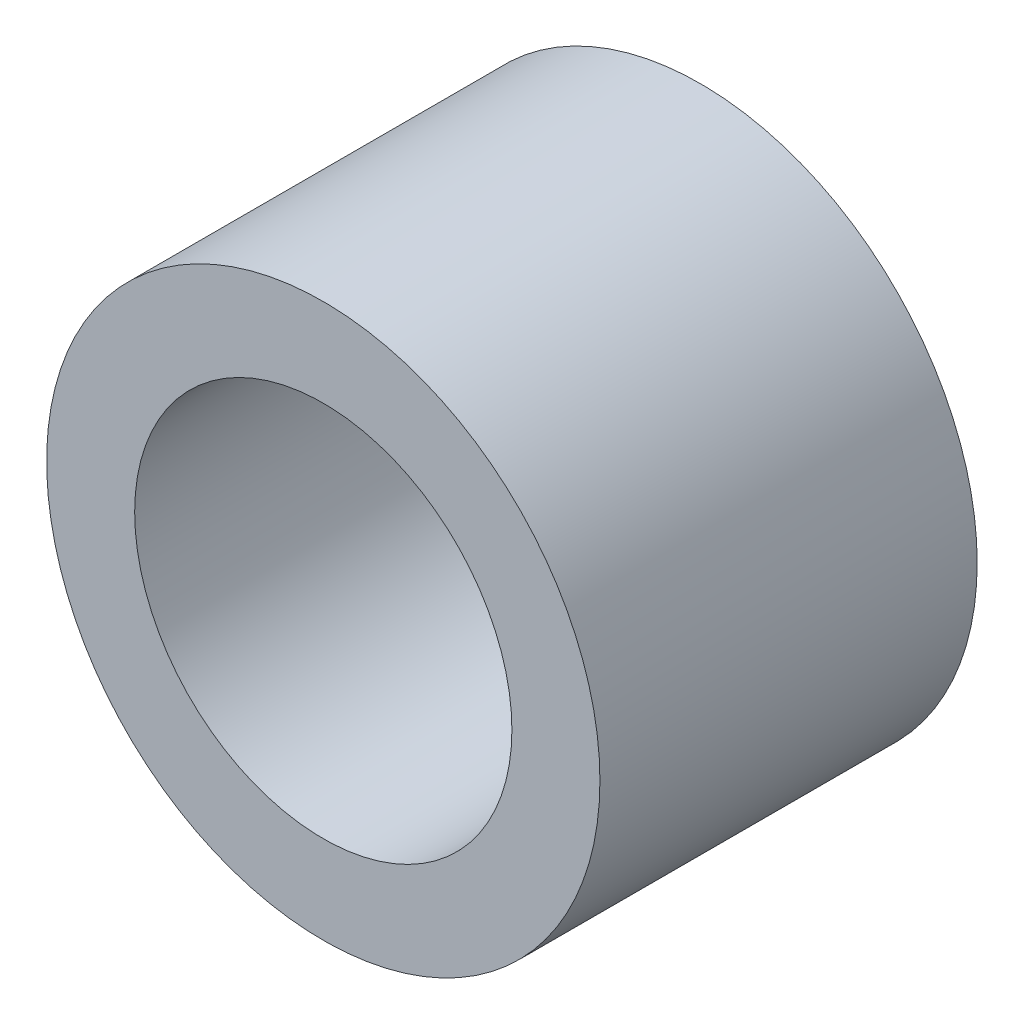
ISO-10303-21;
HEADER;
FILE_DESCRIPTION(('STEP AP214'),'2;1');
FILE_NAME('part.step','',(''),(''),'','','');
FILE_SCHEMA(('AUTOMOTIVE_DESIGN { 1 0 10303 214 1 1 1 1 }'));
ENDSEC;
DATA;
#1=APPLICATION_CONTEXT('core data for automotive mechanical design processes');
#2=APPLICATION_PROTOCOL_DEFINITION('international standard','automotive_design',2000,#1);
#3=PRODUCT_CONTEXT('',#1,'mechanical');
#4=PRODUCT('Part','Part','',(#3));
#5=PRODUCT_RELATED_PRODUCT_CATEGORY('part','',(#4));
#6=PRODUCT_DEFINITION_FORMATION('','',#4);
#7=PRODUCT_DEFINITION_CONTEXT('part definition',#1,'design');
#8=PRODUCT_DEFINITION('design','',#6,#7);
#9=PRODUCT_DEFINITION_SHAPE('','',#8);
#10=(LENGTH_UNIT() NAMED_UNIT(*) SI_UNIT(.MILLI.,.METRE.));
#11=(NAMED_UNIT(*) PLANE_ANGLE_UNIT() SI_UNIT($,.RADIAN.));
#12=(NAMED_UNIT(*) SI_UNIT($,.STERADIAN.) SOLID_ANGLE_UNIT());
#13=UNCERTAINTY_MEASURE_WITH_UNIT(LENGTH_MEASURE(1.E-05),#10,'distance_accuracy_value','');
#14=(GEOMETRIC_REPRESENTATION_CONTEXT(3) GLOBAL_UNCERTAINTY_ASSIGNED_CONTEXT((#13)) GLOBAL_UNIT_ASSIGNED_CONTEXT((#10,
#11,#12)) REPRESENTATION_CONTEXT('',''));
#15=CARTESIAN_POINT('',(0.,0.,0.));
#16=DIRECTION('',(0.,0.,1.));
#17=DIRECTION('',(1.,0.,0.));
#18=AXIS2_PLACEMENT_3D('',#15,#16,#17);
#19=CARTESIAN_POINT('',(0.,0.,3.));
#20=DIRECTION('',(0.,0.,1.));
#21=DIRECTION('',(1.,0.,0.));
#22=AXIS2_PLACEMENT_3D('',#19,#20,#21);
#23=PLANE('',#22);
#24=CARTESIAN_POINT('',(0.,0.,3.));
#25=DIRECTION('',(0.,0.,1.));
#26=DIRECTION('',(1.,0.,0.));
#27=AXIS2_PLACEMENT_3D('',#24,#25,#26);
#28=CIRCLE('',#27,2.2);
#29=CARTESIAN_POINT('',(2.2,0.,3.));
#30=VERTEX_POINT('',#29);
#31=EDGE_CURVE('E10',#30,#30,#28,.T.);
#32=ORIENTED_EDGE('',*,*,#31,.T.);
#33=EDGE_LOOP('',(#32));
#34=FACE_BOUND('',#33,.T.);
#35=CARTESIAN_POINT('',(0.,0.,3.));
#36=DIRECTION('',(0.,0.,1.));
#37=DIRECTION('',(1.,0.,0.));
#38=AXIS2_PLACEMENT_3D('',#35,#36,#37);
#39=CIRCLE('',#38,1.5);
#40=CARTESIAN_POINT('',(1.5,0.,3.));
#41=VERTEX_POINT('',#40);
#42=EDGE_CURVE('E50',#41,#41,#39,.T.);
#43=ORIENTED_EDGE('',*,*,#42,.F.);
#44=EDGE_LOOP('',(#43));
#45=FACE_BOUND('',#44,.T.);
#46=ADVANCED_FACE('F39',(#34,#45),#23,.T.);
#47=CARTESIAN_POINT('',(0.,0.,0.));
#48=DIRECTION('',(0.,0.,1.));
#49=DIRECTION('',(1.,0.,0.));
#50=AXIS2_PLACEMENT_3D('',#47,#48,#49);
#51=PLANE('',#50);
#52=CARTESIAN_POINT('',(0.,0.,0.));
#53=DIRECTION('',(0.,0.,1.));
#54=DIRECTION('',(1.,0.,0.));
#55=AXIS2_PLACEMENT_3D('',#52,#53,#54);
#56=CIRCLE('',#55,2.2);
#57=CARTESIAN_POINT('',(2.2,0.,0.));
#58=VERTEX_POINT('',#57);
#59=EDGE_CURVE('E43',#58,#58,#56,.T.);
#60=ORIENTED_EDGE('',*,*,#59,.F.);
#61=EDGE_LOOP('',(#60));
#62=FACE_BOUND('',#61,.T.);
#63=CARTESIAN_POINT('',(0.,0.,0.));
#64=DIRECTION('',(0.,0.,1.));
#65=DIRECTION('',(1.,0.,0.));
#66=AXIS2_PLACEMENT_3D('',#63,#64,#65);
#67=CIRCLE('',#66,1.5);
#68=CARTESIAN_POINT('',(1.5,0.,0.));
#69=VERTEX_POINT('',#68);
#70=EDGE_CURVE('E52',#69,#69,#67,.T.);
#71=ORIENTED_EDGE('',*,*,#70,.T.);
#72=EDGE_LOOP('',(#71));
#73=FACE_BOUND('',#72,.T.);
#74=ADVANCED_FACE('F62',(#62,#73),#51,.F.);
#75=CARTESIAN_POINT('',(0.,0.,3.));
#76=DIRECTION('',(0.,0.,-1.));
#77=DIRECTION('',(-1.,0.,0.));
#78=AXIS2_PLACEMENT_3D('',#75,#76,#77);
#79=CYLINDRICAL_SURFACE('',#78,2.2);
#80=ORIENTED_EDGE('',*,*,#31,.F.);
#81=EDGE_LOOP('',(#80));
#82=FACE_BOUND('',#81,.T.);
#83=ORIENTED_EDGE('',*,*,#59,.T.);
#84=EDGE_LOOP('',(#83));
#85=FACE_BOUND('',#84,.T.);
#86=ADVANCED_FACE('F41',(#82,#85),#79,.T.);
#87=CARTESIAN_POINT('',(0.,0.,3.));
#88=DIRECTION('',(0.,0.,-1.));
#89=DIRECTION('',(-1.,0.,0.));
#90=AXIS2_PLACEMENT_3D('',#87,#88,#89);
#91=CYLINDRICAL_SURFACE('',#90,1.5);
#92=ORIENTED_EDGE('',*,*,#42,.T.);
#93=EDGE_LOOP('',(#92));
#94=FACE_BOUND('',#93,.T.);
#95=ORIENTED_EDGE('',*,*,#70,.F.);
#96=EDGE_LOOP('',(#95));
#97=FACE_BOUND('',#96,.T.);
#98=ADVANCED_FACE('F58',(#94,#97),#91,.F.);
#99=CLOSED_SHELL('',(#46,#74,#86,#98));
#100=MANIFOLD_SOLID_BREP('B2',#99);
#101=ADVANCED_BREP_SHAPE_REPRESENTATION('',(#18,#100),#14);
#102=SHAPE_DEFINITION_REPRESENTATION(#9,#101);
ENDSEC;
END-ISO-10303-21;
